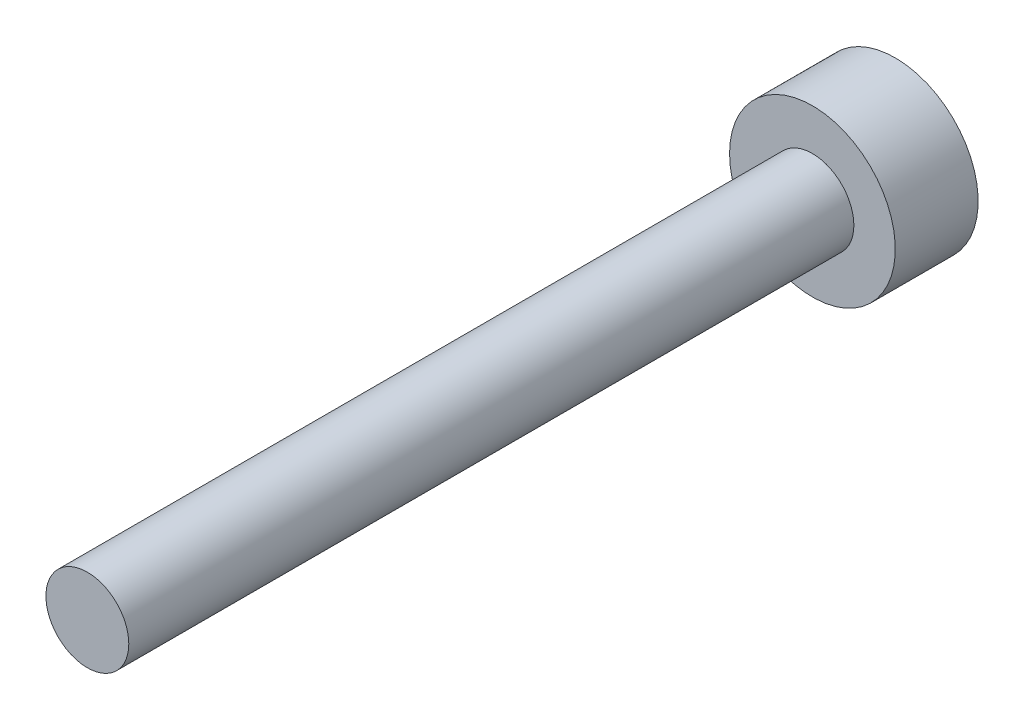
ISO-10303-21;
HEADER;
FILE_DESCRIPTION(('STEP AP214'),'2;1');
FILE_NAME('part.step','',(''),(''),'','','');
FILE_SCHEMA(('AUTOMOTIVE_DESIGN { 1 0 10303 214 1 1 1 1 }'));
ENDSEC;
DATA;
#1=APPLICATION_CONTEXT('core data for automotive mechanical design processes');
#2=APPLICATION_PROTOCOL_DEFINITION('international standard','automotive_design',2000,#1);
#3=PRODUCT_CONTEXT('',#1,'mechanical');
#4=PRODUCT('Part','Part','',(#3));
#5=PRODUCT_RELATED_PRODUCT_CATEGORY('part','',(#4));
#6=PRODUCT_DEFINITION_FORMATION('','',#4);
#7=PRODUCT_DEFINITION_CONTEXT('part definition',#1,'design');
#8=PRODUCT_DEFINITION('design','',#6,#7);
#9=PRODUCT_DEFINITION_SHAPE('','',#8);
#10=(LENGTH_UNIT() NAMED_UNIT(*) SI_UNIT(.MILLI.,.METRE.));
#11=(NAMED_UNIT(*) PLANE_ANGLE_UNIT() SI_UNIT($,.RADIAN.));
#12=(NAMED_UNIT(*) SI_UNIT($,.STERADIAN.) SOLID_ANGLE_UNIT());
#13=UNCERTAINTY_MEASURE_WITH_UNIT(LENGTH_MEASURE(1.E-05),#10,'distance_accuracy_value','');
#14=(GEOMETRIC_REPRESENTATION_CONTEXT(3) GLOBAL_UNCERTAINTY_ASSIGNED_CONTEXT((#13)) GLOBAL_UNIT_ASSIGNED_CONTEXT((#10,
#11,#12)) REPRESENTATION_CONTEXT('',''));
#15=CARTESIAN_POINT('',(0.,0.,0.));
#16=DIRECTION('',(0.,0.,1.));
#17=DIRECTION('',(1.,0.,0.));
#18=AXIS2_PLACEMENT_3D('',#15,#16,#17);
#19=CARTESIAN_POINT('',(0.,0.,7.));
#20=DIRECTION('',(0.,0.,-1.));
#21=DIRECTION('',(-1.,0.,0.));
#22=AXIS2_PLACEMENT_3D('',#19,#20,#21);
#23=CYLINDRICAL_SURFACE('',#22,0.4);
#24=CARTESIAN_POINT('',(0.,0.,7.));
#25=DIRECTION('',(0.,0.,1.));
#26=DIRECTION('',(1.,0.,0.));
#27=AXIS2_PLACEMENT_3D('',#24,#25,#26);
#28=CIRCLE('',#27,0.4);
#29=CARTESIAN_POINT('',(0.4,0.,7.));
#30=VERTEX_POINT('',#29);
#31=EDGE_CURVE('E11',#30,#30,#28,.T.);
#32=ORIENTED_EDGE('',*,*,#31,.F.);
#33=EDGE_LOOP('',(#32));
#34=FACE_BOUND('',#33,.T.);
#35=CARTESIAN_POINT('',(0.,0.,0.));
#36=DIRECTION('',(0.,0.,1.));
#37=DIRECTION('',(1.,0.,0.));
#38=AXIS2_PLACEMENT_3D('',#35,#36,#37);
#39=CIRCLE('',#38,0.4);
#40=CARTESIAN_POINT('',(0.4,0.,0.));
#41=VERTEX_POINT('',#40);
#42=EDGE_CURVE('E35',#41,#41,#39,.T.);
#43=ORIENTED_EDGE('',*,*,#42,.T.);
#44=EDGE_LOOP('',(#43));
#45=FACE_BOUND('',#44,.T.);
#46=ADVANCED_FACE('F32',(#34,#45),#23,.T.);
#47=CARTESIAN_POINT('',(0.,0.,7.));
#48=DIRECTION('',(0.,0.,1.));
#49=DIRECTION('',(1.,0.,0.));
#50=AXIS2_PLACEMENT_3D('',#47,#48,#49);
#51=PLANE('',#50);
#52=ORIENTED_EDGE('',*,*,#31,.T.);
#53=EDGE_LOOP('',(#52));
#54=FACE_BOUND('',#53,.T.);
#55=ADVANCED_FACE('F164',(#54),#51,.T.);
#56=CARTESIAN_POINT('',(0.,0.,-0.8));
#57=DIRECTION('',(0.,0.,1.));
#58=DIRECTION('',(1.,0.,0.));
#59=AXIS2_PLACEMENT_3D('',#56,#57,#58);
#60=CYLINDRICAL_SURFACE('',#59,0.8);
#61=CARTESIAN_POINT('',(0.,0.,-0.8));
#62=DIRECTION('',(0.,0.,-1.));
#63=DIRECTION('',(-1.,0.,0.));
#64=AXIS2_PLACEMENT_3D('',#61,#62,#63);
#65=CIRCLE('',#64,0.8);
#66=CARTESIAN_POINT('',(-0.8,0.,-0.8));
#67=VERTEX_POINT('',#66);
#68=EDGE_CURVE('E139',#67,#67,#65,.T.);
#69=ORIENTED_EDGE('',*,*,#68,.F.);
#70=EDGE_LOOP('',(#69));
#71=FACE_BOUND('',#70,.T.);
#72=CARTESIAN_POINT('',(0.,0.,0.));
#73=DIRECTION('',(0.,0.,-1.));
#74=DIRECTION('',(-1.,0.,0.));
#75=AXIS2_PLACEMENT_3D('',#72,#73,#74);
#76=CIRCLE('',#75,0.8);
#77=CARTESIAN_POINT('',(-0.8,0.,0.));
#78=VERTEX_POINT('',#77);
#79=EDGE_CURVE('E133',#78,#78,#76,.T.);
#80=ORIENTED_EDGE('',*,*,#79,.T.);
#81=EDGE_LOOP('',(#80));
#82=FACE_BOUND('',#81,.T.);
#83=ADVANCED_FACE('F145',(#71,#82),#60,.T.);
#84=CARTESIAN_POINT('',(0.,0.,-0.8));
#85=DIRECTION('',(0.,0.,-1.));
#86=DIRECTION('',(-1.,0.,0.));
#87=AXIS2_PLACEMENT_3D('',#84,#85,#86);
#88=PLANE('',#87);
#89=DIRECTION('',(-0.5,0.866025403784439,0.));
#90=VECTOR('',#89,1.);
#91=CARTESIAN_POINT('',(-0.2,-0.346410161513776,-0.8));
#92=LINE('',#91,#90);
#93=CARTESIAN_POINT('',(-0.2,-0.346410161513776,-0.8));
#94=VERTEX_POINT('',#93);
#95=CARTESIAN_POINT('',(-0.4,0.,-0.8));
#96=VERTEX_POINT('',#95);
#97=EDGE_CURVE('E46',#94,#96,#92,.T.);
#98=ORIENTED_EDGE('',*,*,#97,.F.);
#99=DIRECTION('',(-1.,0.,0.));
#100=VECTOR('',#99,1.);
#101=CARTESIAN_POINT('',(0.2,-0.346410161513776,-0.8));
#102=LINE('',#101,#100);
#103=CARTESIAN_POINT('',(0.2,-0.346410161513776,-0.8));
#104=VERTEX_POINT('',#103);
#105=EDGE_CURVE('E129',#104,#94,#102,.T.);
#106=ORIENTED_EDGE('',*,*,#105,.F.);
#107=DIRECTION('',(-0.5,-0.866025403784439,0.));
#108=VECTOR('',#107,1.);
#109=CARTESIAN_POINT('',(0.4,0.,-0.8));
#110=LINE('',#109,#108);
#111=CARTESIAN_POINT('',(0.4,0.,-0.8));
#112=VERTEX_POINT('',#111);
#113=EDGE_CURVE('E127',#112,#104,#110,.T.);
#114=ORIENTED_EDGE('',*,*,#113,.F.);
#115=DIRECTION('',(0.5,-0.866025403784439,0.));
#116=VECTOR('',#115,1.);
#117=CARTESIAN_POINT('',(0.2,0.346410161513776,-0.8));
#118=LINE('',#117,#116);
#119=CARTESIAN_POINT('',(0.2,0.346410161513776,-0.8));
#120=VERTEX_POINT('',#119);
#121=EDGE_CURVE('E94',#120,#112,#118,.T.);
#122=ORIENTED_EDGE('',*,*,#121,.F.);
#123=DIRECTION('',(1.,0.,0.));
#124=VECTOR('',#123,1.);
#125=CARTESIAN_POINT('',(-0.2,0.346410161513776,-0.8));
#126=LINE('',#125,#124);
#127=CARTESIAN_POINT('',(-0.2,0.346410161513776,-0.8));
#128=VERTEX_POINT('',#127);
#129=EDGE_CURVE('E123',#128,#120,#126,.T.);
#130=ORIENTED_EDGE('',*,*,#129,.F.);
#131=DIRECTION('',(0.5,0.866025403784439,0.));
#132=VECTOR('',#131,1.);
#133=CARTESIAN_POINT('',(-0.4,0.,-0.8));
#134=LINE('',#133,#132);
#135=EDGE_CURVE('E120',#96,#128,#134,.T.);
#136=ORIENTED_EDGE('',*,*,#135,.F.);
#137=EDGE_LOOP('',(#98,#106,#114,#122,#130,#136));
#138=FACE_BOUND('',#137,.T.);
#139=ORIENTED_EDGE('',*,*,#68,.T.);
#140=EDGE_LOOP('',(#139));
#141=FACE_BOUND('',#140,.T.);
#142=ADVANCED_FACE('F150',(#138,#141),#88,.T.);
#143=CARTESIAN_POINT('',(0.,0.,0.));
#144=DIRECTION('',(0.,0.,-1.));
#145=DIRECTION('',(-1.,0.,0.));
#146=AXIS2_PLACEMENT_3D('',#143,#144,#145);
#147=PLANE('',#146);
#148=ORIENTED_EDGE('',*,*,#42,.F.);
#149=EDGE_LOOP('',(#148));
#150=FACE_BOUND('',#149,.T.);
#151=ORIENTED_EDGE('',*,*,#79,.F.);
#152=EDGE_LOOP('',(#151));
#153=FACE_BOUND('',#152,.T.);
#154=ADVANCED_FACE('F147',(#150,#153),#147,.F.);
#155=CARTESIAN_POINT('',(-0.2,-0.346410161513776,-0.4));
#156=DIRECTION('',(-0.866025403784439,-0.5,0.));
#157=DIRECTION('',(0.5,-0.866025403784439,0.));
#158=AXIS2_PLACEMENT_3D('',#155,#156,#157);
#159=PLANE('',#158);
#160=ORIENTED_EDGE('',*,*,#97,.T.);
#161=DIRECTION('',(0.,0.,-1.));
#162=VECTOR('',#161,1.);
#163=CARTESIAN_POINT('',(-0.4,0.,-0.4));
#164=LINE('',#163,#162);
#165=CARTESIAN_POINT('',(-0.4,0.,-0.4));
#166=VERTEX_POINT('',#165);
#167=EDGE_CURVE('E76',#166,#96,#164,.T.);
#168=ORIENTED_EDGE('',*,*,#167,.F.);
#169=DIRECTION('',(-0.5,0.866025403784439,0.));
#170=VECTOR('',#169,1.);
#171=CARTESIAN_POINT('',(-0.2,-0.346410161513776,-0.4));
#172=LINE('',#171,#170);
#173=CARTESIAN_POINT('',(-0.2,-0.346410161513776,-0.4));
#174=VERTEX_POINT('',#173);
#175=EDGE_CURVE('E131',#174,#166,#172,.T.);
#176=ORIENTED_EDGE('',*,*,#175,.F.);
#177=DIRECTION('',(0.,0.,-1.));
#178=VECTOR('',#177,1.);
#179=CARTESIAN_POINT('',(-0.2,-0.346410161513776,-0.4));
#180=LINE('',#179,#178);
#181=EDGE_CURVE('E54',#174,#94,#180,.T.);
#182=ORIENTED_EDGE('',*,*,#181,.T.);
#183=EDGE_LOOP('',(#160,#168,#176,#182));
#184=FACE_BOUND('',#183,.T.);
#185=ADVANCED_FACE('F149',(#184),#159,.F.);
#186=CARTESIAN_POINT('',(0.2,-0.346410161513776,-0.4));
#187=DIRECTION('',(0.,-1.,0.));
#188=DIRECTION('',(0.,0.,-1.));
#189=AXIS2_PLACEMENT_3D('',#186,#187,#188);
#190=PLANE('',#189);
#191=ORIENTED_EDGE('',*,*,#105,.T.);
#192=ORIENTED_EDGE('',*,*,#181,.F.);
#193=DIRECTION('',(-1.,0.,0.));
#194=VECTOR('',#193,1.);
#195=CARTESIAN_POINT('',(0.2,-0.346410161513776,-0.4));
#196=LINE('',#195,#194);
#197=CARTESIAN_POINT('',(0.2,-0.346410161513776,-0.4));
#198=VERTEX_POINT('',#197);
#199=EDGE_CURVE('E106',#198,#174,#196,.T.);
#200=ORIENTED_EDGE('',*,*,#199,.F.);
#201=DIRECTION('',(0.,0.,-1.));
#202=VECTOR('',#201,1.);
#203=CARTESIAN_POINT('',(0.2,-0.346410161513776,-0.4));
#204=LINE('',#203,#202);
#205=EDGE_CURVE('E98',#198,#104,#204,.T.);
#206=ORIENTED_EDGE('',*,*,#205,.T.);
#207=EDGE_LOOP('',(#191,#192,#200,#206));
#208=FACE_BOUND('',#207,.T.);
#209=ADVANCED_FACE('F157',(#208),#190,.F.);
#210=CARTESIAN_POINT('',(0.4,0.,-0.4));
#211=DIRECTION('',(0.866025403784439,-0.5,0.));
#212=DIRECTION('',(0.5,0.866025403784439,0.));
#213=AXIS2_PLACEMENT_3D('',#210,#211,#212);
#214=PLANE('',#213);
#215=ORIENTED_EDGE('',*,*,#113,.T.);
#216=ORIENTED_EDGE('',*,*,#205,.F.);
#217=DIRECTION('',(-0.5,-0.866025403784439,0.));
#218=VECTOR('',#217,1.);
#219=CARTESIAN_POINT('',(0.4,0.,-0.4));
#220=LINE('',#219,#218);
#221=CARTESIAN_POINT('',(0.4,0.,-0.4));
#222=VERTEX_POINT('',#221);
#223=EDGE_CURVE('E102',#222,#198,#220,.T.);
#224=ORIENTED_EDGE('',*,*,#223,.F.);
#225=DIRECTION('',(0.,0.,-1.));
#226=VECTOR('',#225,1.);
#227=CARTESIAN_POINT('',(0.4,0.,-0.4));
#228=LINE('',#227,#226);
#229=EDGE_CURVE('E87',#222,#112,#228,.T.);
#230=ORIENTED_EDGE('',*,*,#229,.T.);
#231=EDGE_LOOP('',(#215,#216,#224,#230));
#232=FACE_BOUND('',#231,.T.);
#233=ADVANCED_FACE('F103',(#232),#214,.F.);
#234=CARTESIAN_POINT('',(0.2,0.346410161513776,-0.4));
#235=DIRECTION('',(0.866025403784439,0.5,0.));
#236=DIRECTION('',(-0.5,0.866025403784439,0.));
#237=AXIS2_PLACEMENT_3D('',#234,#235,#236);
#238=PLANE('',#237);
#239=ORIENTED_EDGE('',*,*,#121,.T.);
#240=ORIENTED_EDGE('',*,*,#229,.F.);
#241=DIRECTION('',(0.5,-0.866025403784439,0.));
#242=VECTOR('',#241,1.);
#243=CARTESIAN_POINT('',(0.2,0.346410161513776,-0.4));
#244=LINE('',#243,#242);
#245=CARTESIAN_POINT('',(0.2,0.346410161513776,-0.4));
#246=VERTEX_POINT('',#245);
#247=EDGE_CURVE('E91',#246,#222,#244,.T.);
#248=ORIENTED_EDGE('',*,*,#247,.F.);
#249=DIRECTION('',(0.,0.,-1.));
#250=VECTOR('',#249,1.);
#251=CARTESIAN_POINT('',(0.2,0.346410161513776,-0.4));
#252=LINE('',#251,#250);
#253=EDGE_CURVE('E99',#246,#120,#252,.T.);
#254=ORIENTED_EDGE('',*,*,#253,.T.);
#255=EDGE_LOOP('',(#239,#240,#248,#254));
#256=FACE_BOUND('',#255,.T.);
#257=ADVANCED_FACE('F89',(#256),#238,.F.);
#258=CARTESIAN_POINT('',(-0.2,0.346410161513776,-0.4));
#259=DIRECTION('',(0.,1.,0.));
#260=DIRECTION('',(-1.,0.,0.));
#261=AXIS2_PLACEMENT_3D('',#258,#259,#260);
#262=PLANE('',#261);
#263=ORIENTED_EDGE('',*,*,#129,.T.);
#264=ORIENTED_EDGE('',*,*,#253,.F.);
#265=DIRECTION('',(1.,0.,0.));
#266=VECTOR('',#265,1.);
#267=CARTESIAN_POINT('',(-0.2,0.346410161513776,-0.4));
#268=LINE('',#267,#266);
#269=CARTESIAN_POINT('',(-0.2,0.346410161513776,-0.4));
#270=VERTEX_POINT('',#269);
#271=EDGE_CURVE('E112',#270,#246,#268,.T.);
#272=ORIENTED_EDGE('',*,*,#271,.F.);
#273=DIRECTION('',(0.,0.,-1.));
#274=VECTOR('',#273,1.);
#275=CARTESIAN_POINT('',(-0.2,0.346410161513776,-0.4));
#276=LINE('',#275,#274);
#277=EDGE_CURVE('E136',#270,#128,#276,.T.);
#278=ORIENTED_EDGE('',*,*,#277,.T.);
#279=EDGE_LOOP('',(#263,#264,#272,#278));
#280=FACE_BOUND('',#279,.T.);
#281=ADVANCED_FACE('F218',(#280),#262,.F.);
#282=CARTESIAN_POINT('',(-0.4,0.,-0.4));
#283=DIRECTION('',(-0.866025403784439,0.5,0.));
#284=DIRECTION('',(-0.5,-0.866025403784439,0.));
#285=AXIS2_PLACEMENT_3D('',#282,#283,#284);
#286=PLANE('',#285);
#287=ORIENTED_EDGE('',*,*,#135,.T.);
#288=ORIENTED_EDGE('',*,*,#277,.F.);
#289=DIRECTION('',(0.5,0.866025403784439,0.));
#290=VECTOR('',#289,1.);
#291=CARTESIAN_POINT('',(-0.4,0.,-0.4));
#292=LINE('',#291,#290);
#293=EDGE_CURVE('E114',#166,#270,#292,.T.);
#294=ORIENTED_EDGE('',*,*,#293,.F.);
#295=ORIENTED_EDGE('',*,*,#167,.T.);
#296=EDGE_LOOP('',(#287,#288,#294,#295));
#297=FACE_BOUND('',#296,.T.);
#298=ADVANCED_FACE('F227',(#297),#286,.F.);
#299=CARTESIAN_POINT('',(0.,0.,-0.4));
#300=DIRECTION('',(0.,0.,-1.));
#301=DIRECTION('',(-1.,0.,0.));
#302=AXIS2_PLACEMENT_3D('',#299,#300,#301);
#303=PLANE('',#302);
#304=ORIENTED_EDGE('',*,*,#175,.T.);
#305=ORIENTED_EDGE('',*,*,#293,.T.);
#306=ORIENTED_EDGE('',*,*,#271,.T.);
#307=ORIENTED_EDGE('',*,*,#247,.T.);
#308=ORIENTED_EDGE('',*,*,#223,.T.);
#309=ORIENTED_EDGE('',*,*,#199,.T.);
#310=EDGE_LOOP('',(#304,#305,#306,#307,#308,#309));
#311=FACE_BOUND('',#310,.T.);
#312=ADVANCED_FACE('F109',(#311),#303,.T.);
#313=CLOSED_SHELL('',(#46,#55,#83,#142,#154,#185,#209,#233,#257,#281,#298,#312));
#314=MANIFOLD_SOLID_BREP('B2',#313);
#315=ADVANCED_BREP_SHAPE_REPRESENTATION('',(#18,#314),#14);
#316=SHAPE_DEFINITION_REPRESENTATION(#9,#315);
ENDSEC;
END-ISO-10303-21;
